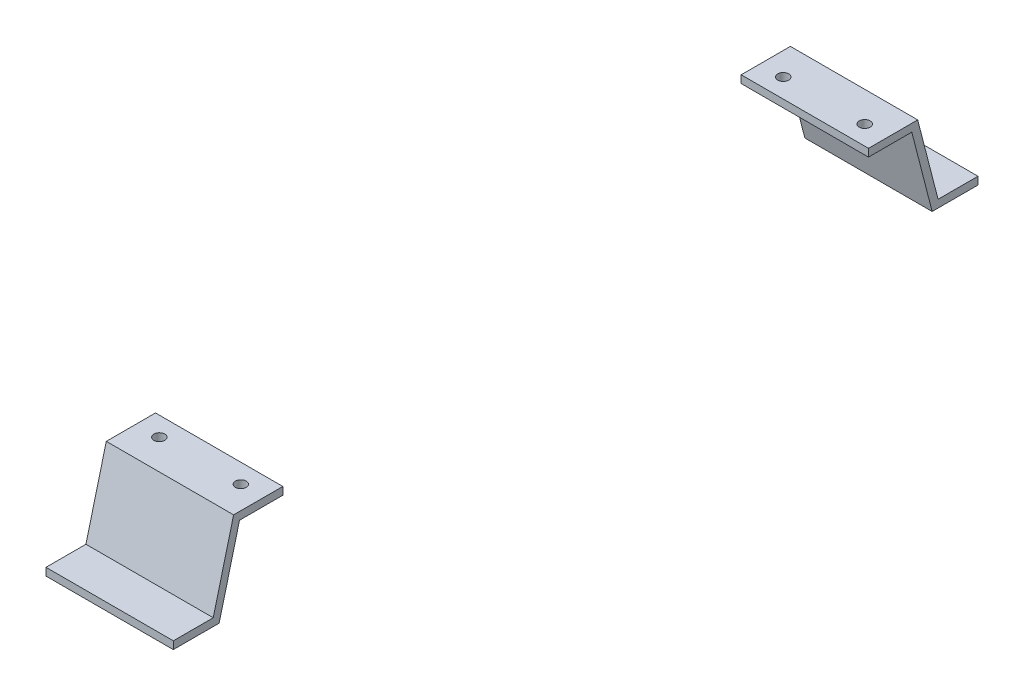
ISO-10303-21;
HEADER;
FILE_DESCRIPTION(('STEP AP214'),'2;1');
FILE_NAME('part.step','',(''),(''),'','','');
FILE_SCHEMA(('AUTOMOTIVE_DESIGN { 1 0 10303 214 1 1 1 1 }'));
ENDSEC;
DATA;
#1=APPLICATION_CONTEXT('core data for automotive mechanical design processes');
#2=APPLICATION_PROTOCOL_DEFINITION('international standard','automotive_design',2000,#1);
#3=PRODUCT_CONTEXT('',#1,'mechanical');
#4=PRODUCT('Part','Part','',(#3));
#5=PRODUCT_RELATED_PRODUCT_CATEGORY('part','',(#4));
#6=PRODUCT_DEFINITION_FORMATION('','',#4);
#7=PRODUCT_DEFINITION_CONTEXT('part definition',#1,'design');
#8=PRODUCT_DEFINITION('design','',#6,#7);
#9=PRODUCT_DEFINITION_SHAPE('','',#8);
#10=(LENGTH_UNIT() NAMED_UNIT(*) SI_UNIT(.MILLI.,.METRE.));
#11=(NAMED_UNIT(*) PLANE_ANGLE_UNIT() SI_UNIT($,.RADIAN.));
#12=(NAMED_UNIT(*) SI_UNIT($,.STERADIAN.) SOLID_ANGLE_UNIT());
#13=UNCERTAINTY_MEASURE_WITH_UNIT(LENGTH_MEASURE(1.E-05),#10,'distance_accuracy_value','');
#14=(GEOMETRIC_REPRESENTATION_CONTEXT(3) GLOBAL_UNCERTAINTY_ASSIGNED_CONTEXT((#13)) GLOBAL_UNIT_ASSIGNED_CONTEXT((#10,
#11,#12)) REPRESENTATION_CONTEXT('',''));
#15=CARTESIAN_POINT('',(0.,0.,0.));
#16=DIRECTION('',(0.,0.,1.));
#17=DIRECTION('',(1.,0.,0.));
#18=AXIS2_PLACEMENT_3D('',#15,#16,#17);
#19=CARTESIAN_POINT('',(25.,163.,-132.));
#20=DIRECTION('',(0.,1.,0.));
#21=DIRECTION('',(0.,0.,-1.));
#22=AXIS2_PLACEMENT_3D('',#19,#20,#21);
#23=PLANE('',#22);
#24=CARTESIAN_POINT('',(16.,163.,-122.5));
#25=DIRECTION('',(0.,-1.,0.));
#26=DIRECTION('',(0.,0.,-1.));
#27=AXIS2_PLACEMENT_3D('',#24,#25,#26);
#28=CIRCLE('',#27,2.14999999999999);
#29=CARTESIAN_POINT('',(16.,163.,-124.65));
#30=VERTEX_POINT('',#29);
#31=EDGE_CURVE('E248',#30,#30,#28,.T.);
#32=ORIENTED_EDGE('',*,*,#31,.F.);
#33=EDGE_LOOP('',(#32));
#34=FACE_BOUND('',#33,.T.);
#35=CARTESIAN_POINT('',(-16.,163.,-122.5));
#36=DIRECTION('',(0.,-1.,0.));
#37=DIRECTION('',(0.,0.,-1.));
#38=AXIS2_PLACEMENT_3D('',#35,#36,#37);
#39=CIRCLE('',#38,2.14999999999999);
#40=CARTESIAN_POINT('',(-16.,163.,-124.65));
#41=VERTEX_POINT('',#40);
#42=EDGE_CURVE('E171',#41,#41,#39,.T.);
#43=ORIENTED_EDGE('',*,*,#42,.F.);
#44=EDGE_LOOP('',(#43));
#45=FACE_BOUND('',#44,.T.);
#46=DIRECTION('',(0.,0.,1.));
#47=VECTOR('',#46,1.);
#48=CARTESIAN_POINT('',(-25.,163.,-132.));
#49=LINE('',#48,#47);
#50=CARTESIAN_POINT('',(-25.,163.,-132.));
#51=VERTEX_POINT('',#50);
#52=CARTESIAN_POINT('',(-25.,163.,-115.));
#53=VERTEX_POINT('',#52);
#54=EDGE_CURVE('E167',#51,#53,#49,.T.);
#55=ORIENTED_EDGE('',*,*,#54,.F.);
#56=DIRECTION('',(-1.,0.,0.));
#57=VECTOR('',#56,1.);
#58=CARTESIAN_POINT('',(25.,163.,-132.));
#59=LINE('',#58,#57);
#60=CARTESIAN_POINT('',(25.,163.,-132.));
#61=VERTEX_POINT('',#60);
#62=EDGE_CURVE('E166',#61,#51,#59,.T.);
#63=ORIENTED_EDGE('',*,*,#62,.F.);
#64=DIRECTION('',(0.,0.,1.));
#65=VECTOR('',#64,1.);
#66=CARTESIAN_POINT('',(25.,163.,-132.));
#67=LINE('',#66,#65);
#68=CARTESIAN_POINT('',(25.,163.,-115.));
#69=VERTEX_POINT('',#68);
#70=EDGE_CURVE('E187',#61,#69,#67,.T.);
#71=ORIENTED_EDGE('',*,*,#70,.T.);
#72=DIRECTION('',(-1.,0.,0.));
#73=VECTOR('',#72,1.);
#74=CARTESIAN_POINT('',(25.,163.,-115.));
#75=LINE('',#74,#73);
#76=EDGE_CURVE('E12',#69,#53,#75,.T.);
#77=ORIENTED_EDGE('',*,*,#76,.T.);
#78=EDGE_LOOP('',(#55,#63,#71,#77));
#79=FACE_BOUND('',#78,.T.);
#80=ADVANCED_FACE('F51',(#34,#45,#79),#23,.F.);
#81=CARTESIAN_POINT('',(25.,166.,-115.));
#82=DIRECTION('',(0.,0.,1.));
#83=DIRECTION('',(-1.,0.,0.));
#84=AXIS2_PLACEMENT_3D('',#81,#82,#83);
#85=PLANE('',#84);
#86=DIRECTION('',(0.,-1.,0.));
#87=VECTOR('',#86,1.);
#88=CARTESIAN_POINT('',(-25.,166.,-115.));
#89=LINE('',#88,#87);
#90=CARTESIAN_POINT('',(-25.,166.,-115.));
#91=VERTEX_POINT('',#90);
#92=EDGE_CURVE('E170',#91,#53,#89,.T.);
#93=ORIENTED_EDGE('',*,*,#92,.T.);
#94=ORIENTED_EDGE('',*,*,#76,.F.);
#95=DIRECTION('',(0.,-1.,0.));
#96=VECTOR('',#95,1.);
#97=CARTESIAN_POINT('',(25.,166.,-115.));
#98=LINE('',#97,#96);
#99=CARTESIAN_POINT('',(25.,166.,-115.));
#100=VERTEX_POINT('',#99);
#101=EDGE_CURVE('E115',#100,#69,#98,.T.);
#102=ORIENTED_EDGE('',*,*,#101,.F.);
#103=DIRECTION('',(-1.,0.,0.));
#104=VECTOR('',#103,1.);
#105=CARTESIAN_POINT('',(25.,166.,-115.));
#106=LINE('',#105,#104);
#107=EDGE_CURVE('E60',#100,#91,#106,.T.);
#108=ORIENTED_EDGE('',*,*,#107,.T.);
#109=EDGE_LOOP('',(#93,#94,#102,#108));
#110=FACE_BOUND('',#109,.T.);
#111=ADVANCED_FACE('F205',(#110),#85,.T.);
#112=CARTESIAN_POINT('',(25.,166.,-132.));
#113=DIRECTION('',(0.,1.,0.));
#114=DIRECTION('',(0.,0.,-1.));
#115=AXIS2_PLACEMENT_3D('',#112,#113,#114);
#116=PLANE('',#115);
#117=CARTESIAN_POINT('',(16.,166.,-122.5));
#118=DIRECTION('',(0.,-1.,0.));
#119=DIRECTION('',(0.,0.,-1.));
#120=AXIS2_PLACEMENT_3D('',#117,#118,#119);
#121=CIRCLE('',#120,2.14999999999999);
#122=CARTESIAN_POINT('',(16.,166.,-124.65));
#123=VERTEX_POINT('',#122);
#124=EDGE_CURVE('E258',#123,#123,#121,.T.);
#125=ORIENTED_EDGE('',*,*,#124,.T.);
#126=EDGE_LOOP('',(#125));
#127=FACE_BOUND('',#126,.T.);
#128=CARTESIAN_POINT('',(-16.,166.,-122.5));
#129=DIRECTION('',(0.,-1.,0.));
#130=DIRECTION('',(0.,0.,-1.));
#131=AXIS2_PLACEMENT_3D('',#128,#129,#130);
#132=CIRCLE('',#131,2.14999999999999);
#133=CARTESIAN_POINT('',(-16.,166.,-124.65));
#134=VERTEX_POINT('',#133);
#135=EDGE_CURVE('E253',#134,#134,#132,.T.);
#136=ORIENTED_EDGE('',*,*,#135,.T.);
#137=EDGE_LOOP('',(#136));
#138=FACE_BOUND('',#137,.T.);
#139=DIRECTION('',(0.,0.,1.));
#140=VECTOR('',#139,1.);
#141=CARTESIAN_POINT('',(-25.,166.,-132.));
#142=LINE('',#141,#140);
#143=CARTESIAN_POINT('',(-25.,166.,-134.324092372951));
#144=VERTEX_POINT('',#143);
#145=EDGE_CURVE('E174',#144,#91,#142,.T.);
#146=ORIENTED_EDGE('',*,*,#145,.T.);
#147=ORIENTED_EDGE('',*,*,#107,.F.);
#148=DIRECTION('',(0.,0.,1.));
#149=VECTOR('',#148,1.);
#150=CARTESIAN_POINT('',(25.,166.,-132.));
#151=LINE('',#150,#149);
#152=CARTESIAN_POINT('',(25.,166.,-134.324092372951));
#153=VERTEX_POINT('',#152);
#154=EDGE_CURVE('E218',#153,#100,#151,.T.);
#155=ORIENTED_EDGE('',*,*,#154,.F.);
#156=DIRECTION('',(-1.,0.,0.));
#157=VECTOR('',#156,1.);
#158=CARTESIAN_POINT('',(25.,166.,-134.324092372951));
#159=LINE('',#158,#157);
#160=EDGE_CURVE('E196',#153,#144,#159,.T.);
#161=ORIENTED_EDGE('',*,*,#160,.T.);
#162=EDGE_LOOP('',(#146,#147,#155,#161));
#163=FACE_BOUND('',#162,.T.);
#164=ADVANCED_FACE('F229',(#127,#138,#163),#116,.T.);
#165=CARTESIAN_POINT('',(25.,132.749634057065,-142.904831971128));
#166=DIRECTION('',(0.,0.24987801902177,-0.968277323709357));
#167=DIRECTION('',(0.,-0.968277323709358,-0.24987801902177));
#168=AXIS2_PLACEMENT_3D('',#165,#166,#167);
#169=PLANE('',#168);
#170=DIRECTION('',(0.,0.968277323709358,0.24987801902177));
#171=VECTOR('',#170,1.);
#172=CARTESIAN_POINT('',(-25.,132.749634057065,-142.904831971128));
#173=LINE('',#172,#171);
#174=CARTESIAN_POINT('',(-25.,135.,-142.324092372951));
#175=VERTEX_POINT('',#174);
#176=EDGE_CURVE('E177',#175,#144,#173,.T.);
#177=ORIENTED_EDGE('',*,*,#176,.T.);
#178=ORIENTED_EDGE('',*,*,#160,.F.);
#179=DIRECTION('',(0.,0.968277323709358,0.24987801902177));
#180=VECTOR('',#179,1.);
#181=CARTESIAN_POINT('',(25.,132.749634057065,-142.904831971128));
#182=LINE('',#181,#180);
#183=CARTESIAN_POINT('',(25.,135.,-142.324092372951));
#184=VERTEX_POINT('',#183);
#185=EDGE_CURVE('E160',#184,#153,#182,.T.);
#186=ORIENTED_EDGE('',*,*,#185,.F.);
#187=DIRECTION('',(-1.,0.,0.));
#188=VECTOR('',#187,1.);
#189=CARTESIAN_POINT('',(25.,135.,-142.324092372951));
#190=LINE('',#189,#188);
#191=EDGE_CURVE('E193',#184,#175,#190,.T.);
#192=ORIENTED_EDGE('',*,*,#191,.T.);
#193=EDGE_LOOP('',(#177,#178,#186,#192));
#194=FACE_BOUND('',#193,.T.);
#195=ADVANCED_FACE('F228',(#194),#169,.T.);
#196=CARTESIAN_POINT('',(25.,135.,-158.));
#197=DIRECTION('',(0.,1.,0.));
#198=DIRECTION('',(0.,0.,-1.));
#199=AXIS2_PLACEMENT_3D('',#196,#197,#198);
#200=PLANE('',#199);
#201=DIRECTION('',(0.,0.,1.));
#202=VECTOR('',#201,1.);
#203=CARTESIAN_POINT('',(-25.,135.,-158.));
#204=LINE('',#203,#202);
#205=CARTESIAN_POINT('',(-25.,135.,-158.));
#206=VERTEX_POINT('',#205);
#207=EDGE_CURVE('E180',#206,#175,#204,.T.);
#208=ORIENTED_EDGE('',*,*,#207,.T.);
#209=ORIENTED_EDGE('',*,*,#191,.F.);
#210=DIRECTION('',(0.,0.,1.));
#211=VECTOR('',#210,1.);
#212=CARTESIAN_POINT('',(25.,135.,-158.));
#213=LINE('',#212,#211);
#214=CARTESIAN_POINT('',(25.,135.,-158.));
#215=VERTEX_POINT('',#214);
#216=EDGE_CURVE('E155',#215,#184,#213,.T.);
#217=ORIENTED_EDGE('',*,*,#216,.F.);
#218=DIRECTION('',(-1.,0.,0.));
#219=VECTOR('',#218,1.);
#220=CARTESIAN_POINT('',(25.,135.,-158.));
#221=LINE('',#220,#219);
#222=EDGE_CURVE('E148',#215,#206,#221,.T.);
#223=ORIENTED_EDGE('',*,*,#222,.T.);
#224=EDGE_LOOP('',(#208,#209,#217,#223));
#225=FACE_BOUND('',#224,.T.);
#226=ADVANCED_FACE('F237',(#225),#200,.T.);
#227=CARTESIAN_POINT('',(25.,132.,-158.));
#228=DIRECTION('',(0.,0.,-1.));
#229=DIRECTION('',(1.,0.,0.));
#230=AXIS2_PLACEMENT_3D('',#227,#228,#229);
#231=PLANE('',#230);
#232=DIRECTION('',(0.,1.,0.));
#233=VECTOR('',#232,1.);
#234=CARTESIAN_POINT('',(-25.,132.,-158.));
#235=LINE('',#234,#233);
#236=CARTESIAN_POINT('',(-25.,132.,-158.));
#237=VERTEX_POINT('',#236);
#238=EDGE_CURVE('E182',#237,#206,#235,.T.);
#239=ORIENTED_EDGE('',*,*,#238,.T.);
#240=ORIENTED_EDGE('',*,*,#222,.F.);
#241=DIRECTION('',(0.,1.,0.));
#242=VECTOR('',#241,1.);
#243=CARTESIAN_POINT('',(25.,132.,-158.));
#244=LINE('',#243,#242);
#245=CARTESIAN_POINT('',(25.,132.,-158.));
#246=VERTEX_POINT('',#245);
#247=EDGE_CURVE('E136',#246,#215,#244,.T.);
#248=ORIENTED_EDGE('',*,*,#247,.F.);
#249=DIRECTION('',(-1.,0.,0.));
#250=VECTOR('',#249,1.);
#251=CARTESIAN_POINT('',(25.,132.,-158.));
#252=LINE('',#251,#250);
#253=EDGE_CURVE('E142',#246,#237,#252,.T.);
#254=ORIENTED_EDGE('',*,*,#253,.T.);
#255=EDGE_LOOP('',(#239,#240,#248,#254));
#256=FACE_BOUND('',#255,.T.);
#257=ADVANCED_FACE('F151',(#256),#231,.T.);
#258=CARTESIAN_POINT('',(25.,132.,-158.));
#259=DIRECTION('',(0.,1.,0.));
#260=DIRECTION('',(0.,0.,-1.));
#261=AXIS2_PLACEMENT_3D('',#258,#259,#260);
#262=PLANE('',#261);
#263=DIRECTION('',(0.,0.,1.));
#264=VECTOR('',#263,1.);
#265=CARTESIAN_POINT('',(-25.,132.,-158.));
#266=LINE('',#265,#264);
#267=CARTESIAN_POINT('',(-25.,132.,-140.));
#268=VERTEX_POINT('',#267);
#269=EDGE_CURVE('E144',#237,#268,#266,.T.);
#270=ORIENTED_EDGE('',*,*,#269,.F.);
#271=ORIENTED_EDGE('',*,*,#253,.F.);
#272=DIRECTION('',(0.,0.,1.));
#273=VECTOR('',#272,1.);
#274=CARTESIAN_POINT('',(25.,132.,-158.));
#275=LINE('',#274,#273);
#276=CARTESIAN_POINT('',(25.,132.,-140.));
#277=VERTEX_POINT('',#276);
#278=EDGE_CURVE('E132',#246,#277,#275,.T.);
#279=ORIENTED_EDGE('',*,*,#278,.T.);
#280=DIRECTION('',(-1.,0.,0.));
#281=VECTOR('',#280,1.);
#282=CARTESIAN_POINT('',(25.,132.,-140.));
#283=LINE('',#282,#281);
#284=EDGE_CURVE('E149',#277,#268,#283,.T.);
#285=ORIENTED_EDGE('',*,*,#284,.T.);
#286=EDGE_LOOP('',(#270,#271,#279,#285));
#287=FACE_BOUND('',#286,.T.);
#288=ADVANCED_FACE('F143',(#287),#262,.F.);
#289=CARTESIAN_POINT('',(25.,132.,-140.));
#290=DIRECTION('',(0.,0.24987801902177,-0.968277323709357));
#291=DIRECTION('',(0.,-0.968277323709358,-0.24987801902177));
#292=AXIS2_PLACEMENT_3D('',#289,#290,#291);
#293=PLANE('',#292);
#294=DIRECTION('',(0.,0.968277323709358,0.24987801902177));
#295=VECTOR('',#294,1.);
#296=CARTESIAN_POINT('',(-25.,132.,-140.));
#297=LINE('',#296,#295);
#298=EDGE_CURVE('E101',#268,#51,#297,.T.);
#299=ORIENTED_EDGE('',*,*,#298,.F.);
#300=ORIENTED_EDGE('',*,*,#284,.F.);
#301=DIRECTION('',(0.,0.968277323709358,0.24987801902177));
#302=VECTOR('',#301,1.);
#303=CARTESIAN_POINT('',(25.,132.,-140.));
#304=LINE('',#303,#302);
#305=EDGE_CURVE('E71',#277,#61,#304,.T.);
#306=ORIENTED_EDGE('',*,*,#305,.T.);
#307=ORIENTED_EDGE('',*,*,#62,.T.);
#308=EDGE_LOOP('',(#299,#300,#306,#307));
#309=FACE_BOUND('',#308,.T.);
#310=ADVANCED_FACE('F276',(#309),#293,.F.);
#311=CARTESIAN_POINT('',(25.,0.,0.));
#312=DIRECTION('',(-1.,0.,0.));
#313=DIRECTION('',(0.,0.,-1.));
#314=AXIS2_PLACEMENT_3D('',#311,#312,#313);
#315=PLANE('',#314);
#316=ORIENTED_EDGE('',*,*,#70,.F.);
#317=ORIENTED_EDGE('',*,*,#305,.F.);
#318=ORIENTED_EDGE('',*,*,#278,.F.);
#319=ORIENTED_EDGE('',*,*,#247,.T.);
#320=ORIENTED_EDGE('',*,*,#216,.T.);
#321=ORIENTED_EDGE('',*,*,#185,.T.);
#322=ORIENTED_EDGE('',*,*,#154,.T.);
#323=ORIENTED_EDGE('',*,*,#101,.T.);
#324=EDGE_LOOP('',(#316,#317,#318,#319,#320,#321,#322,#323));
#325=FACE_BOUND('',#324,.T.);
#326=ADVANCED_FACE('F134',(#325),#315,.F.);
#327=CARTESIAN_POINT('',(-25.,0.,0.));
#328=DIRECTION('',(-1.,0.,0.));
#329=DIRECTION('',(0.,0.,-1.));
#330=AXIS2_PLACEMENT_3D('',#327,#328,#329);
#331=PLANE('',#330);
#332=ORIENTED_EDGE('',*,*,#54,.T.);
#333=ORIENTED_EDGE('',*,*,#92,.F.);
#334=ORIENTED_EDGE('',*,*,#145,.F.);
#335=ORIENTED_EDGE('',*,*,#176,.F.);
#336=ORIENTED_EDGE('',*,*,#207,.F.);
#337=ORIENTED_EDGE('',*,*,#238,.F.);
#338=ORIENTED_EDGE('',*,*,#269,.T.);
#339=ORIENTED_EDGE('',*,*,#298,.T.);
#340=EDGE_LOOP('',(#332,#333,#334,#335,#336,#337,#338,#339));
#341=FACE_BOUND('',#340,.T.);
#342=ADVANCED_FACE('F209',(#341),#331,.T.);
#343=CARTESIAN_POINT('',(-16.,166.,-122.5));
#344=DIRECTION('',(0.,1.,0.));
#345=DIRECTION('',(0.,0.,-1.));
#346=AXIS2_PLACEMENT_3D('',#343,#344,#345);
#347=CYLINDRICAL_SURFACE('',#346,2.14999999999999);
#348=ORIENTED_EDGE('',*,*,#42,.T.);
#349=EDGE_LOOP('',(#348));
#350=FACE_BOUND('',#349,.T.);
#351=ORIENTED_EDGE('',*,*,#135,.F.);
#352=EDGE_LOOP('',(#351));
#353=FACE_BOUND('',#352,.T.);
#354=ADVANCED_FACE('F266',(#350,#353),#347,.F.);
#355=CARTESIAN_POINT('',(16.,166.,-122.5));
#356=DIRECTION('',(0.,1.,0.));
#357=DIRECTION('',(0.,0.,-1.));
#358=AXIS2_PLACEMENT_3D('',#355,#356,#357);
#359=CYLINDRICAL_SURFACE('',#358,2.14999999999999);
#360=ORIENTED_EDGE('',*,*,#31,.T.);
#361=EDGE_LOOP('',(#360));
#362=FACE_BOUND('',#361,.T.);
#363=ORIENTED_EDGE('',*,*,#124,.F.);
#364=EDGE_LOOP('',(#363));
#365=FACE_BOUND('',#364,.T.);
#366=ADVANCED_FACE('F264',(#362,#365),#359,.F.);
#367=CLOSED_SHELL('',(#80,#111,#164,#195,#226,#257,#288,#310,#326,#342,#354,#366));
#368=MANIFOLD_SOLID_BREP('B2',#367);
#369=CARTESIAN_POINT('',(25.,163.,132.));
#370=DIRECTION('',(0.,1.,0.));
#371=DIRECTION('',(0.,0.,1.));
#372=AXIS2_PLACEMENT_3D('',#369,#370,#371);
#373=PLANE('',#372);
#374=CARTESIAN_POINT('',(16.,163.,122.5));
#375=DIRECTION('',(0.,1.,0.));
#376=DIRECTION('',(0.,0.,1.));
#377=AXIS2_PLACEMENT_3D('',#374,#375,#376);
#378=CIRCLE('',#377,2.14999999999999);
#379=CARTESIAN_POINT('',(16.,163.,124.65));
#380=VERTEX_POINT('',#379);
#381=EDGE_CURVE('E558',#380,#380,#378,.T.);
#382=ORIENTED_EDGE('',*,*,#381,.T.);
#383=EDGE_LOOP('',(#382));
#384=FACE_BOUND('',#383,.T.);
#385=CARTESIAN_POINT('',(-16.,163.,122.5));
#386=DIRECTION('',(0.,1.,0.));
#387=DIRECTION('',(0.,0.,1.));
#388=AXIS2_PLACEMENT_3D('',#385,#386,#387);
#389=CIRCLE('',#388,2.14999999999999);
#390=CARTESIAN_POINT('',(-16.,163.,124.65));
#391=VERTEX_POINT('',#390);
#392=EDGE_CURVE('E492',#391,#391,#389,.T.);
#393=ORIENTED_EDGE('',*,*,#392,.T.);
#394=EDGE_LOOP('',(#393));
#395=FACE_BOUND('',#394,.T.);
#396=DIRECTION('',(0.,0.,-1.));
#397=VECTOR('',#396,1.);
#398=CARTESIAN_POINT('',(-25.,163.,132.));
#399=LINE('',#398,#397);
#400=CARTESIAN_POINT('',(-25.,163.,132.));
#401=VERTEX_POINT('',#400);
#402=CARTESIAN_POINT('',(-25.,163.,115.));
#403=VERTEX_POINT('',#402);
#404=EDGE_CURVE('E487',#401,#403,#399,.T.);
#405=ORIENTED_EDGE('',*,*,#404,.T.);
#406=DIRECTION('',(-1.,0.,0.));
#407=VECTOR('',#406,1.);
#408=CARTESIAN_POINT('',(25.,163.,115.));
#409=LINE('',#408,#407);
#410=CARTESIAN_POINT('',(25.,163.,115.));
#411=VERTEX_POINT('',#410);
#412=EDGE_CURVE('E49',#411,#403,#409,.T.);
#413=ORIENTED_EDGE('',*,*,#412,.F.);
#414=DIRECTION('',(0.,0.,-1.));
#415=VECTOR('',#414,1.);
#416=CARTESIAN_POINT('',(25.,163.,132.));
#417=LINE('',#416,#415);
#418=CARTESIAN_POINT('',(25.,163.,132.));
#419=VERTEX_POINT('',#418);
#420=EDGE_CURVE('E437',#419,#411,#417,.T.);
#421=ORIENTED_EDGE('',*,*,#420,.F.);
#422=DIRECTION('',(-1.,0.,0.));
#423=VECTOR('',#422,1.);
#424=CARTESIAN_POINT('',(25.,163.,132.));
#425=LINE('',#424,#423);
#426=EDGE_CURVE('E486',#419,#401,#425,.T.);
#427=ORIENTED_EDGE('',*,*,#426,.T.);
#428=EDGE_LOOP('',(#405,#413,#421,#427));
#429=FACE_BOUND('',#428,.T.);
#430=ADVANCED_FACE('F366',(#384,#395,#429),#373,.F.);
#431=CARTESIAN_POINT('',(25.,166.,115.));
#432=DIRECTION('',(0.,0.,-1.));
#433=DIRECTION('',(-1.,0.,0.));
#434=AXIS2_PLACEMENT_3D('',#431,#432,#433);
#435=PLANE('',#434);
#436=DIRECTION('',(0.,-1.,0.));
#437=VECTOR('',#436,1.);
#438=CARTESIAN_POINT('',(-25.,166.,115.));
#439=LINE('',#438,#437);
#440=CARTESIAN_POINT('',(-25.,166.,115.));
#441=VERTEX_POINT('',#440);
#442=EDGE_CURVE('E491',#441,#403,#439,.T.);
#443=ORIENTED_EDGE('',*,*,#442,.F.);
#444=DIRECTION('',(-1.,0.,0.));
#445=VECTOR('',#444,1.);
#446=CARTESIAN_POINT('',(25.,166.,115.));
#447=LINE('',#446,#445);
#448=CARTESIAN_POINT('',(25.,166.,115.));
#449=VERTEX_POINT('',#448);
#450=EDGE_CURVE('E375',#449,#441,#447,.T.);
#451=ORIENTED_EDGE('',*,*,#450,.F.);
#452=DIRECTION('',(0.,-1.,0.));
#453=VECTOR('',#452,1.);
#454=CARTESIAN_POINT('',(25.,166.,115.));
#455=LINE('',#454,#453);
#456=EDGE_CURVE('E543',#449,#411,#455,.T.);
#457=ORIENTED_EDGE('',*,*,#456,.T.);
#458=ORIENTED_EDGE('',*,*,#412,.T.);
#459=EDGE_LOOP('',(#443,#451,#457,#458));
#460=FACE_BOUND('',#459,.T.);
#461=ADVANCED_FACE('F534',(#460),#435,.T.);
#462=CARTESIAN_POINT('',(25.,166.,132.));
#463=DIRECTION('',(0.,1.,0.));
#464=DIRECTION('',(0.,0.,1.));
#465=AXIS2_PLACEMENT_3D('',#462,#463,#464);
#466=PLANE('',#465);
#467=CARTESIAN_POINT('',(16.,166.,122.5));
#468=DIRECTION('',(0.,1.,0.));
#469=DIRECTION('',(0.,0.,1.));
#470=AXIS2_PLACEMENT_3D('',#467,#468,#469);
#471=CIRCLE('',#470,2.14999999999999);
#472=CARTESIAN_POINT('',(16.,166.,124.65));
#473=VERTEX_POINT('',#472);
#474=EDGE_CURVE('E562',#473,#473,#471,.T.);
#475=ORIENTED_EDGE('',*,*,#474,.F.);
#476=EDGE_LOOP('',(#475));
#477=FACE_BOUND('',#476,.T.);
#478=CARTESIAN_POINT('',(-16.,166.,122.5));
#479=DIRECTION('',(0.,1.,0.));
#480=DIRECTION('',(0.,0.,1.));
#481=AXIS2_PLACEMENT_3D('',#478,#479,#480);
#482=CIRCLE('',#481,2.14999999999999);
#483=CARTESIAN_POINT('',(-16.,166.,124.65));
#484=VERTEX_POINT('',#483);
#485=EDGE_CURVE('E554',#484,#484,#482,.T.);
#486=ORIENTED_EDGE('',*,*,#485,.F.);
#487=EDGE_LOOP('',(#486));
#488=FACE_BOUND('',#487,.T.);
#489=DIRECTION('',(0.,0.,-1.));
#490=VECTOR('',#489,1.);
#491=CARTESIAN_POINT('',(-25.,166.,132.));
#492=LINE('',#491,#490);
#493=CARTESIAN_POINT('',(-25.,166.,134.324092372951));
#494=VERTEX_POINT('',#493);
#495=EDGE_CURVE('E496',#494,#441,#492,.T.);
#496=ORIENTED_EDGE('',*,*,#495,.F.);
#497=DIRECTION('',(-1.,0.,0.));
#498=VECTOR('',#497,1.);
#499=CARTESIAN_POINT('',(25.,166.,134.324092372951));
#500=LINE('',#499,#498);
#501=CARTESIAN_POINT('',(25.,166.,134.324092372951));
#502=VERTEX_POINT('',#501);
#503=EDGE_CURVE('E521',#502,#494,#500,.T.);
#504=ORIENTED_EDGE('',*,*,#503,.F.);
#505=DIRECTION('',(0.,0.,-1.));
#506=VECTOR('',#505,1.);
#507=CARTESIAN_POINT('',(25.,166.,132.));
#508=LINE('',#507,#506);
#509=EDGE_CURVE('E531',#502,#449,#508,.T.);
#510=ORIENTED_EDGE('',*,*,#509,.T.);
#511=ORIENTED_EDGE('',*,*,#450,.T.);
#512=EDGE_LOOP('',(#496,#504,#510,#511));
#513=FACE_BOUND('',#512,.T.);
#514=ADVANCED_FACE('F529',(#477,#488,#513),#466,.T.);
#515=CARTESIAN_POINT('',(25.,132.749634057065,142.904831971128));
#516=DIRECTION('',(0.,0.24987801902177,0.968277323709357));
#517=DIRECTION('',(0.,-0.968277323709358,0.24987801902177));
#518=AXIS2_PLACEMENT_3D('',#515,#516,#517);
#519=PLANE('',#518);
#520=DIRECTION('',(0.,0.968277323709358,-0.24987801902177));
#521=VECTOR('',#520,1.);
#522=CARTESIAN_POINT('',(-25.,132.749634057065,142.904831971128));
#523=LINE('',#522,#521);
#524=CARTESIAN_POINT('',(-25.,135.,142.324092372951));
#525=VERTEX_POINT('',#524);
#526=EDGE_CURVE('E500',#525,#494,#523,.T.);
#527=ORIENTED_EDGE('',*,*,#526,.F.);
#528=DIRECTION('',(-1.,0.,0.));
#529=VECTOR('',#528,1.);
#530=CARTESIAN_POINT('',(25.,135.,142.324092372951));
#531=LINE('',#530,#529);
#532=CARTESIAN_POINT('',(25.,135.,142.324092372951));
#533=VERTEX_POINT('',#532);
#534=EDGE_CURVE('E518',#533,#525,#531,.T.);
#535=ORIENTED_EDGE('',*,*,#534,.F.);
#536=DIRECTION('',(0.,0.968277323709358,-0.24987801902177));
#537=VECTOR('',#536,1.);
#538=CARTESIAN_POINT('',(25.,132.749634057065,142.904831971128));
#539=LINE('',#538,#537);
#540=EDGE_CURVE('E480',#533,#502,#539,.T.);
#541=ORIENTED_EDGE('',*,*,#540,.T.);
#542=ORIENTED_EDGE('',*,*,#503,.T.);
#543=EDGE_LOOP('',(#527,#535,#541,#542));
#544=FACE_BOUND('',#543,.T.);
#545=ADVANCED_FACE('F541',(#544),#519,.T.);
#546=CARTESIAN_POINT('',(25.,135.,158.));
#547=DIRECTION('',(0.,1.,0.));
#548=DIRECTION('',(0.,0.,1.));
#549=AXIS2_PLACEMENT_3D('',#546,#547,#548);
#550=PLANE('',#549);
#551=DIRECTION('',(0.,0.,-1.));
#552=VECTOR('',#551,1.);
#553=CARTESIAN_POINT('',(-25.,135.,158.));
#554=LINE('',#553,#552);
#555=CARTESIAN_POINT('',(-25.,135.,158.));
#556=VERTEX_POINT('',#555);
#557=EDGE_CURVE('E503',#556,#525,#554,.T.);
#558=ORIENTED_EDGE('',*,*,#557,.F.);
#559=DIRECTION('',(-1.,0.,0.));
#560=VECTOR('',#559,1.);
#561=CARTESIAN_POINT('',(25.,135.,158.));
#562=LINE('',#561,#560);
#563=CARTESIAN_POINT('',(25.,135.,158.));
#564=VERTEX_POINT('',#563);
#565=EDGE_CURVE('E463',#564,#556,#562,.T.);
#566=ORIENTED_EDGE('',*,*,#565,.F.);
#567=DIRECTION('',(0.,0.,-1.));
#568=VECTOR('',#567,1.);
#569=CARTESIAN_POINT('',(25.,135.,158.));
#570=LINE('',#569,#568);
#571=EDGE_CURVE('E474',#564,#533,#570,.T.);
#572=ORIENTED_EDGE('',*,*,#571,.T.);
#573=ORIENTED_EDGE('',*,*,#534,.T.);
#574=EDGE_LOOP('',(#558,#566,#572,#573));
#575=FACE_BOUND('',#574,.T.);
#576=ADVANCED_FACE('F606',(#575),#550,.T.);
#577=CARTESIAN_POINT('',(25.,132.,158.));
#578=DIRECTION('',(0.,0.,1.));
#579=DIRECTION('',(1.,0.,0.));
#580=AXIS2_PLACEMENT_3D('',#577,#578,#579);
#581=PLANE('',#580);
#582=DIRECTION('',(0.,1.,0.));
#583=VECTOR('',#582,1.);
#584=CARTESIAN_POINT('',(-25.,132.,158.));
#585=LINE('',#584,#583);
#586=CARTESIAN_POINT('',(-25.,132.,158.));
#587=VERTEX_POINT('',#586);
#588=EDGE_CURVE('E461',#587,#556,#585,.T.);
#589=ORIENTED_EDGE('',*,*,#588,.F.);
#590=DIRECTION('',(-1.,0.,0.));
#591=VECTOR('',#590,1.);
#592=CARTESIAN_POINT('',(25.,132.,158.));
#593=LINE('',#592,#591);
#594=CARTESIAN_POINT('',(25.,132.,158.));
#595=VERTEX_POINT('',#594);
#596=EDGE_CURVE('E455',#595,#587,#593,.T.);
#597=ORIENTED_EDGE('',*,*,#596,.F.);
#598=DIRECTION('',(0.,1.,0.));
#599=VECTOR('',#598,1.);
#600=CARTESIAN_POINT('',(25.,132.,158.));
#601=LINE('',#600,#599);
#602=EDGE_CURVE('E459',#595,#564,#601,.T.);
#603=ORIENTED_EDGE('',*,*,#602,.T.);
#604=ORIENTED_EDGE('',*,*,#565,.T.);
#605=EDGE_LOOP('',(#589,#597,#603,#604));
#606=FACE_BOUND('',#605,.T.);
#607=ADVANCED_FACE('F457',(#606),#581,.T.);
#608=CARTESIAN_POINT('',(25.,132.,158.));
#609=DIRECTION('',(0.,1.,0.));
#610=DIRECTION('',(0.,0.,1.));
#611=AXIS2_PLACEMENT_3D('',#608,#609,#610);
#612=PLANE('',#611);
#613=DIRECTION('',(0.,0.,-1.));
#614=VECTOR('',#613,1.);
#615=CARTESIAN_POINT('',(-25.,132.,158.));
#616=LINE('',#615,#614);
#617=CARTESIAN_POINT('',(-25.,132.,140.));
#618=VERTEX_POINT('',#617);
#619=EDGE_CURVE('E422',#587,#618,#616,.T.);
#620=ORIENTED_EDGE('',*,*,#619,.T.);
#621=DIRECTION('',(-1.,0.,0.));
#622=VECTOR('',#621,1.);
#623=CARTESIAN_POINT('',(25.,132.,140.));
#624=LINE('',#623,#622);
#625=CARTESIAN_POINT('',(25.,132.,140.));
#626=VERTEX_POINT('',#625);
#627=EDGE_CURVE('E464',#626,#618,#624,.T.);
#628=ORIENTED_EDGE('',*,*,#627,.F.);
#629=DIRECTION('',(0.,0.,-1.));
#630=VECTOR('',#629,1.);
#631=CARTESIAN_POINT('',(25.,132.,158.));
#632=LINE('',#631,#630);
#633=EDGE_CURVE('E466',#595,#626,#632,.T.);
#634=ORIENTED_EDGE('',*,*,#633,.F.);
#635=ORIENTED_EDGE('',*,*,#596,.T.);
#636=EDGE_LOOP('',(#620,#628,#634,#635));
#637=FACE_BOUND('',#636,.T.);
#638=ADVANCED_FACE('F467',(#637),#612,.F.);
#639=CARTESIAN_POINT('',(25.,132.,140.));
#640=DIRECTION('',(0.,0.24987801902177,0.968277323709357));
#641=DIRECTION('',(0.,-0.968277323709358,0.24987801902177));
#642=AXIS2_PLACEMENT_3D('',#639,#640,#641);
#643=PLANE('',#642);
#644=DIRECTION('',(0.,0.968277323709358,-0.24987801902177));
#645=VECTOR('',#644,1.);
#646=CARTESIAN_POINT('',(-25.,132.,140.));
#647=LINE('',#646,#645);
#648=EDGE_CURVE('E430',#618,#401,#647,.T.);
#649=ORIENTED_EDGE('',*,*,#648,.T.);
#650=ORIENTED_EDGE('',*,*,#426,.F.);
#651=DIRECTION('',(0.,0.968277323709358,-0.24987801902177));
#652=VECTOR('',#651,1.);
#653=CARTESIAN_POINT('',(25.,132.,140.));
#654=LINE('',#653,#652);
#655=EDGE_CURVE('E386',#626,#419,#654,.T.);
#656=ORIENTED_EDGE('',*,*,#655,.F.);
#657=ORIENTED_EDGE('',*,*,#627,.T.);
#658=EDGE_LOOP('',(#649,#650,#656,#657));
#659=FACE_BOUND('',#658,.T.);
#660=ADVANCED_FACE('F595',(#659),#643,.F.);
#661=CARTESIAN_POINT('',(25.,0.,0.));
#662=DIRECTION('',(-1.,0.,0.));
#663=DIRECTION('',(0.,0.,1.));
#664=AXIS2_PLACEMENT_3D('',#661,#662,#663);
#665=PLANE('',#664);
#666=ORIENTED_EDGE('',*,*,#420,.T.);
#667=ORIENTED_EDGE('',*,*,#456,.F.);
#668=ORIENTED_EDGE('',*,*,#509,.F.);
#669=ORIENTED_EDGE('',*,*,#540,.F.);
#670=ORIENTED_EDGE('',*,*,#571,.F.);
#671=ORIENTED_EDGE('',*,*,#602,.F.);
#672=ORIENTED_EDGE('',*,*,#633,.T.);
#673=ORIENTED_EDGE('',*,*,#655,.T.);
#674=EDGE_LOOP('',(#666,#667,#668,#669,#670,#671,#672,#673));
#675=FACE_BOUND('',#674,.T.);
#676=ADVANCED_FACE('F471',(#675),#665,.F.);
#677=CARTESIAN_POINT('',(-25.,0.,0.));
#678=DIRECTION('',(-1.,0.,0.));
#679=DIRECTION('',(0.,0.,1.));
#680=AXIS2_PLACEMENT_3D('',#677,#678,#679);
#681=PLANE('',#680);
#682=ORIENTED_EDGE('',*,*,#404,.F.);
#683=ORIENTED_EDGE('',*,*,#648,.F.);
#684=ORIENTED_EDGE('',*,*,#619,.F.);
#685=ORIENTED_EDGE('',*,*,#588,.T.);
#686=ORIENTED_EDGE('',*,*,#557,.T.);
#687=ORIENTED_EDGE('',*,*,#526,.T.);
#688=ORIENTED_EDGE('',*,*,#495,.T.);
#689=ORIENTED_EDGE('',*,*,#442,.T.);
#690=EDGE_LOOP('',(#682,#683,#684,#685,#686,#687,#688,#689));
#691=FACE_BOUND('',#690,.T.);
#692=ADVANCED_FACE('F537',(#691),#681,.T.);
#693=CARTESIAN_POINT('',(-16.,166.,122.5));
#694=DIRECTION('',(0.,1.,0.));
#695=DIRECTION('',(0.,0.,1.));
#696=AXIS2_PLACEMENT_3D('',#693,#694,#695);
#697=CYLINDRICAL_SURFACE('',#696,2.14999999999999);
#698=ORIENTED_EDGE('',*,*,#392,.F.);
#699=EDGE_LOOP('',(#698));
#700=FACE_BOUND('',#699,.T.);
#701=ORIENTED_EDGE('',*,*,#485,.T.);
#702=EDGE_LOOP('',(#701));
#703=FACE_BOUND('',#702,.T.);
#704=ADVANCED_FACE('F574',(#700,#703),#697,.F.);
#705=CARTESIAN_POINT('',(16.,166.,122.5));
#706=DIRECTION('',(0.,1.,0.));
#707=DIRECTION('',(0.,0.,1.));
#708=AXIS2_PLACEMENT_3D('',#705,#706,#707);
#709=CYLINDRICAL_SURFACE('',#708,2.14999999999999);
#710=ORIENTED_EDGE('',*,*,#381,.F.);
#711=EDGE_LOOP('',(#710));
#712=FACE_BOUND('',#711,.T.);
#713=ORIENTED_EDGE('',*,*,#474,.T.);
#714=EDGE_LOOP('',(#713));
#715=FACE_BOUND('',#714,.T.);
#716=ADVANCED_FACE('F567',(#712,#715),#709,.F.);
#717=CLOSED_SHELL('',(#430,#461,#514,#545,#576,#607,#638,#660,#676,#692,#704,#716));
#718=MANIFOLD_SOLID_BREP('B6',#717);
#719=ADVANCED_BREP_SHAPE_REPRESENTATION('',(#18,#368,#718),#14);
#720=SHAPE_DEFINITION_REPRESENTATION(#9,#719);
ENDSEC;
END-ISO-10303-21;
